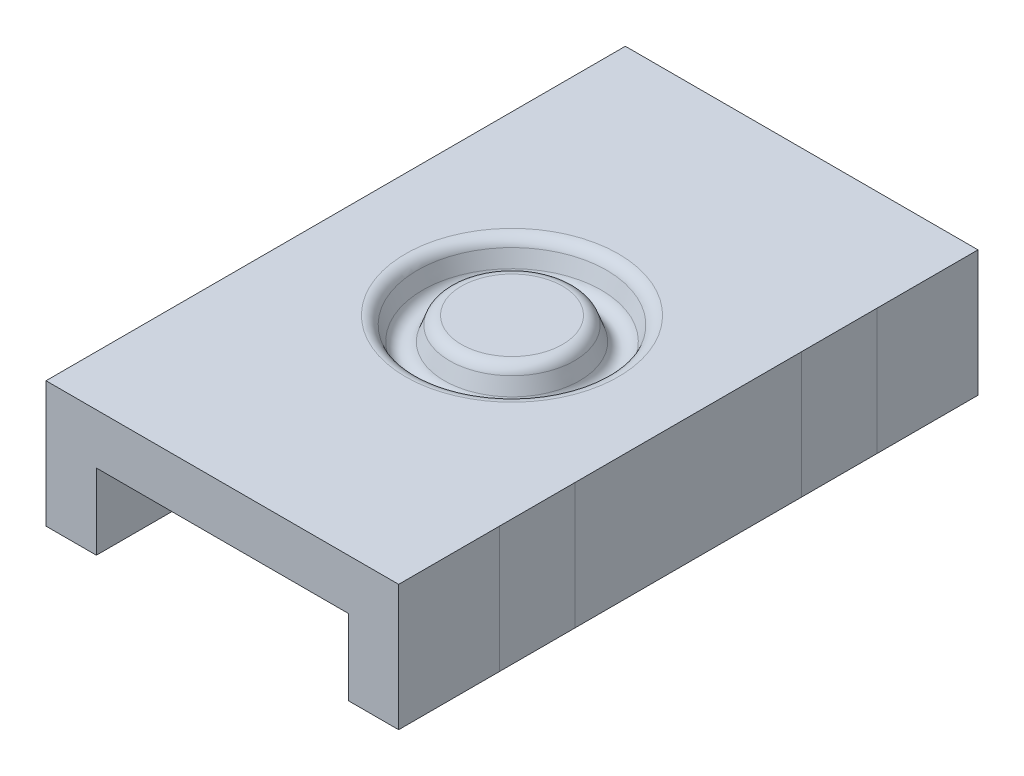
ISO-10303-21;
HEADER;
FILE_DESCRIPTION(('STEP AP214'),'2;1');
FILE_NAME('part.step','',(''),(''),'','','');
FILE_SCHEMA(('AUTOMOTIVE_DESIGN { 1 0 10303 214 1 1 1 1 }'));
ENDSEC;
DATA;
#1=APPLICATION_CONTEXT('core data for automotive mechanical design processes');
#2=APPLICATION_PROTOCOL_DEFINITION('international standard','automotive_design',2000,#1);
#3=PRODUCT_CONTEXT('',#1,'mechanical');
#4=PRODUCT('Part','Part','',(#3));
#5=PRODUCT_RELATED_PRODUCT_CATEGORY('part','',(#4));
#6=PRODUCT_DEFINITION_FORMATION('','',#4);
#7=PRODUCT_DEFINITION_CONTEXT('part definition',#1,'design');
#8=PRODUCT_DEFINITION('design','',#6,#7);
#9=PRODUCT_DEFINITION_SHAPE('','',#8);
#10=(LENGTH_UNIT() NAMED_UNIT(*) SI_UNIT(.MILLI.,.METRE.));
#11=(NAMED_UNIT(*) PLANE_ANGLE_UNIT() SI_UNIT($,.RADIAN.));
#12=(NAMED_UNIT(*) SI_UNIT($,.STERADIAN.) SOLID_ANGLE_UNIT());
#13=UNCERTAINTY_MEASURE_WITH_UNIT(LENGTH_MEASURE(1.E-05),#10,'distance_accuracy_value','');
#14=(GEOMETRIC_REPRESENTATION_CONTEXT(3) GLOBAL_UNCERTAINTY_ASSIGNED_CONTEXT((#13)) GLOBAL_UNIT_ASSIGNED_CONTEXT((#10,
#11,#12)) REPRESENTATION_CONTEXT('',''));
#15=CARTESIAN_POINT('',(0.,0.,0.));
#16=DIRECTION('',(0.,0.,1.));
#17=DIRECTION('',(1.,0.,0.));
#18=AXIS2_PLACEMENT_3D('',#15,#16,#17);
#19=CARTESIAN_POINT('',(14.,10.,23.));
#20=DIRECTION('',(-1.,0.,0.));
#21=DIRECTION('',(0.,0.,1.));
#22=AXIS2_PLACEMENT_3D('',#19,#20,#21);
#23=PLANE('',#22);
#24=DIRECTION('',(0.,-1.,0.));
#25=VECTOR('',#24,1.);
#26=CARTESIAN_POINT('',(14.,10.,-9.));
#27=LINE('',#26,#25);
#28=CARTESIAN_POINT('',(14.,10.,-9.));
#29=VERTEX_POINT('',#28);
#30=CARTESIAN_POINT('',(14.,0.,-9.));
#31=VERTEX_POINT('',#30);
#32=EDGE_CURVE('E12',#29,#31,#27,.T.);
#33=ORIENTED_EDGE('',*,*,#32,.F.);
#34=DIRECTION('',(0.,0.,-1.));
#35=VECTOR('',#34,1.);
#36=CARTESIAN_POINT('',(14.,10.,23.));
#37=LINE('',#36,#35);
#38=CARTESIAN_POINT('',(14.,10.,9.));
#39=VERTEX_POINT('',#38);
#40=EDGE_CURVE('E250',#39,#29,#37,.T.);
#41=ORIENTED_EDGE('',*,*,#40,.F.);
#42=DIRECTION('',(0.,1.,0.));
#43=VECTOR('',#42,1.);
#44=CARTESIAN_POINT('',(14.,10.,9.));
#45=LINE('',#44,#43);
#46=CARTESIAN_POINT('',(14.,0.,9.));
#47=VERTEX_POINT('',#46);
#48=EDGE_CURVE('E206',#47,#39,#45,.T.);
#49=ORIENTED_EDGE('',*,*,#48,.F.);
#50=DIRECTION('',(0.,0.,-1.));
#51=VECTOR('',#50,1.);
#52=CARTESIAN_POINT('',(14.,0.,23.));
#53=LINE('',#52,#51);
#54=EDGE_CURVE('E296',#47,#31,#53,.T.);
#55=ORIENTED_EDGE('',*,*,#54,.T.);
#56=EDGE_LOOP('',(#33,#41,#49,#55));
#57=FACE_BOUND('',#56,.T.);
#58=ADVANCED_FACE('F53',(#57),#23,.F.);
#59=DIRECTION('',(0.,1.,0.));
#60=VECTOR('',#59,1.);
#61=CARTESIAN_POINT('',(14.,9.99999999999999,-15.));
#62=LINE('',#61,#60);
#63=CARTESIAN_POINT('',(14.,0.,-15.));
#64=VERTEX_POINT('',#63);
#65=CARTESIAN_POINT('',(14.,10.,-15.));
#66=VERTEX_POINT('',#65);
#67=EDGE_CURVE('E63',#64,#66,#62,.T.);
#68=ORIENTED_EDGE('',*,*,#67,.F.);
#69=CARTESIAN_POINT('',(14.,0.,-23.));
#70=VERTEX_POINT('',#69);
#71=EDGE_CURVE('E182',#64,#70,#53,.T.);
#72=ORIENTED_EDGE('',*,*,#71,.T.);
#73=DIRECTION('',(0.,-1.,0.));
#74=VECTOR('',#73,1.);
#75=CARTESIAN_POINT('',(14.,10.,-23.));
#76=LINE('',#75,#74);
#77=CARTESIAN_POINT('',(14.,10.,-23.));
#78=VERTEX_POINT('',#77);
#79=EDGE_CURVE('E188',#78,#70,#76,.T.);
#80=ORIENTED_EDGE('',*,*,#79,.F.);
#81=EDGE_CURVE('E247',#66,#78,#37,.T.);
#82=ORIENTED_EDGE('',*,*,#81,.F.);
#83=EDGE_LOOP('',(#68,#72,#80,#82));
#84=FACE_BOUND('',#83,.T.);
#85=ADVANCED_FACE('F306',(#84),#23,.F.);
#86=DIRECTION('',(0.,-1.,0.));
#87=VECTOR('',#86,1.);
#88=CARTESIAN_POINT('',(14.,10.,15.));
#89=LINE('',#88,#87);
#90=CARTESIAN_POINT('',(14.,10.,15.));
#91=VERTEX_POINT('',#90);
#92=CARTESIAN_POINT('',(14.,0.,15.));
#93=VERTEX_POINT('',#92);
#94=EDGE_CURVE('E210',#91,#93,#89,.T.);
#95=ORIENTED_EDGE('',*,*,#94,.F.);
#96=CARTESIAN_POINT('',(14.,10.,23.));
#97=VERTEX_POINT('',#96);
#98=EDGE_CURVE('E242',#97,#91,#37,.T.);
#99=ORIENTED_EDGE('',*,*,#98,.F.);
#100=DIRECTION('',(0.,-1.,0.));
#101=VECTOR('',#100,1.);
#102=CARTESIAN_POINT('',(14.,10.,23.));
#103=LINE('',#102,#101);
#104=CARTESIAN_POINT('',(14.,0.,23.));
#105=VERTEX_POINT('',#104);
#106=EDGE_CURVE('E193',#97,#105,#103,.T.);
#107=ORIENTED_EDGE('',*,*,#106,.T.);
#108=EDGE_CURVE('E173',#105,#93,#53,.T.);
#109=ORIENTED_EDGE('',*,*,#108,.T.);
#110=EDGE_LOOP('',(#95,#99,#107,#109));
#111=FACE_BOUND('',#110,.T.);
#112=ADVANCED_FACE('F290',(#111),#23,.F.);
#113=EDGE_CURVE('E253',#29,#66,#37,.T.);
#114=ORIENTED_EDGE('',*,*,#113,.F.);
#115=ORIENTED_EDGE('',*,*,#32,.T.);
#116=EDGE_CURVE('E277',#31,#64,#53,.T.);
#117=ORIENTED_EDGE('',*,*,#116,.T.);
#118=ORIENTED_EDGE('',*,*,#67,.T.);
#119=EDGE_LOOP('',(#114,#115,#117,#118));
#120=FACE_BOUND('',#119,.T.);
#121=ADVANCED_FACE('F301',(#120),#23,.F.);
#122=CARTESIAN_POINT('',(0.,10.,0.));
#123=DIRECTION('',(0.,-1.,0.));
#124=DIRECTION('',(0.,0.,-1.));
#125=AXIS2_PLACEMENT_3D('',#122,#123,#124);
#126=PLANE('',#125);
#127=CARTESIAN_POINT('',(0.,10.,0.));
#128=DIRECTION('',(0.,-1.,0.));
#129=DIRECTION('',(0.,0.,-1.));
#130=AXIS2_PLACEMENT_3D('',#127,#128,#129);
#131=CIRCLE('',#130,8.45488555142449);
#132=CARTESIAN_POINT('',(0.,10.,-8.45488555142449));
#133=VERTEX_POINT('',#132);
#134=EDGE_CURVE('E229',#133,#133,#131,.T.);
#135=ORIENTED_EDGE('',*,*,#134,.T.);
#136=EDGE_LOOP('',(#135));
#137=FACE_BOUND('',#136,.T.);
#138=DIRECTION('',(0.,0.,1.));
#139=VECTOR('',#138,1.);
#140=CARTESIAN_POINT('',(-14.,10.,23.));
#141=LINE('',#140,#139);
#142=CARTESIAN_POINT('',(-14.,10.,-23.));
#143=VERTEX_POINT('',#142);
#144=CARTESIAN_POINT('',(-14.,10.,23.));
#145=VERTEX_POINT('',#144);
#146=EDGE_CURVE('E178',#143,#145,#141,.T.);
#147=ORIENTED_EDGE('',*,*,#146,.T.);
#148=DIRECTION('',(1.,0.,0.));
#149=VECTOR('',#148,1.);
#150=CARTESIAN_POINT('',(-14.,10.,23.));
#151=LINE('',#150,#149);
#152=EDGE_CURVE('E257',#145,#97,#151,.T.);
#153=ORIENTED_EDGE('',*,*,#152,.T.);
#154=ORIENTED_EDGE('',*,*,#98,.T.);
#155=EDGE_CURVE('E246',#91,#39,#37,.T.);
#156=ORIENTED_EDGE('',*,*,#155,.T.);
#157=ORIENTED_EDGE('',*,*,#40,.T.);
#158=ORIENTED_EDGE('',*,*,#113,.T.);
#159=ORIENTED_EDGE('',*,*,#81,.T.);
#160=DIRECTION('',(-1.,0.,0.));
#161=VECTOR('',#160,1.);
#162=CARTESIAN_POINT('',(-14.,10.,-23.));
#163=LINE('',#162,#161);
#164=EDGE_CURVE('E189',#78,#143,#163,.T.);
#165=ORIENTED_EDGE('',*,*,#164,.T.);
#166=EDGE_LOOP('',(#147,#153,#154,#156,#157,#158,#159,#165));
#167=FACE_BOUND('',#166,.T.);
#168=ADVANCED_FACE('F308',(#137,#167),#126,.F.);
#169=CARTESIAN_POINT('',(0.,0.,0.));
#170=DIRECTION('',(0.,-1.,0.));
#171=DIRECTION('',(0.,0.,-1.));
#172=AXIS2_PLACEMENT_3D('',#169,#170,#171);
#173=PLANE('',#172);
#174=DIRECTION('',(0.,0.,1.));
#175=VECTOR('',#174,1.);
#176=CARTESIAN_POINT('',(-10.,0.,-23.));
#177=LINE('',#176,#175);
#178=CARTESIAN_POINT('',(-10.,0.,-23.));
#179=VERTEX_POINT('',#178);
#180=CARTESIAN_POINT('',(-10.,0.,23.));
#181=VERTEX_POINT('',#180);
#182=EDGE_CURVE('E142',#179,#181,#177,.T.);
#183=ORIENTED_EDGE('',*,*,#182,.T.);
#184=DIRECTION('',(1.,0.,0.));
#185=VECTOR('',#184,1.);
#186=CARTESIAN_POINT('',(-14.,0.,23.));
#187=LINE('',#186,#185);
#188=CARTESIAN_POINT('',(-14.,0.,23.));
#189=VERTEX_POINT('',#188);
#190=EDGE_CURVE('E272',#189,#181,#187,.T.);
#191=ORIENTED_EDGE('',*,*,#190,.F.);
#192=DIRECTION('',(0.,0.,1.));
#193=VECTOR('',#192,1.);
#194=CARTESIAN_POINT('',(-14.,0.,23.));
#195=LINE('',#194,#193);
#196=CARTESIAN_POINT('',(-14.,0.,-23.));
#197=VERTEX_POINT('',#196);
#198=EDGE_CURVE('E170',#197,#189,#195,.T.);
#199=ORIENTED_EDGE('',*,*,#198,.F.);
#200=DIRECTION('',(-1.,0.,0.));
#201=VECTOR('',#200,1.);
#202=CARTESIAN_POINT('',(-14.,0.,-23.));
#203=LINE('',#202,#201);
#204=EDGE_CURVE('E159',#179,#197,#203,.T.);
#205=ORIENTED_EDGE('',*,*,#204,.F.);
#206=EDGE_LOOP('',(#183,#191,#199,#205));
#207=FACE_BOUND('',#206,.T.);
#208=ADVANCED_FACE('F168',(#207),#173,.T.);
#209=CARTESIAN_POINT('',(-14.,10.,23.));
#210=DIRECTION('',(1.,0.,0.));
#211=DIRECTION('',(0.,0.,-1.));
#212=AXIS2_PLACEMENT_3D('',#209,#210,#211);
#213=PLANE('',#212);
#214=ORIENTED_EDGE('',*,*,#198,.T.);
#215=DIRECTION('',(0.,-1.,0.));
#216=VECTOR('',#215,1.);
#217=CARTESIAN_POINT('',(-14.,10.,23.));
#218=LINE('',#217,#216);
#219=EDGE_CURVE('E198',#145,#189,#218,.T.);
#220=ORIENTED_EDGE('',*,*,#219,.F.);
#221=ORIENTED_EDGE('',*,*,#146,.F.);
#222=DIRECTION('',(0.,-1.,0.));
#223=VECTOR('',#222,1.);
#224=CARTESIAN_POINT('',(-14.,10.,-23.));
#225=LINE('',#224,#223);
#226=EDGE_CURVE('E185',#143,#197,#225,.T.);
#227=ORIENTED_EDGE('',*,*,#226,.T.);
#228=EDGE_LOOP('',(#214,#220,#221,#227));
#229=FACE_BOUND('',#228,.T.);
#230=ADVANCED_FACE('F312',(#229),#213,.F.);
#231=CARTESIAN_POINT('',(-14.,10.,23.));
#232=DIRECTION('',(0.,0.,-1.));
#233=DIRECTION('',(-1.,0.,0.));
#234=AXIS2_PLACEMENT_3D('',#231,#232,#233);
#235=PLANE('',#234);
#236=ORIENTED_EDGE('',*,*,#190,.T.);
#237=DIRECTION('',(0.,-1.,0.));
#238=VECTOR('',#237,1.);
#239=CARTESIAN_POINT('',(-10.,0.,23.));
#240=LINE('',#239,#238);
#241=CARTESIAN_POINT('',(-10.,6.,23.));
#242=VERTEX_POINT('',#241);
#243=EDGE_CURVE('E148',#242,#181,#240,.T.);
#244=ORIENTED_EDGE('',*,*,#243,.F.);
#245=DIRECTION('',(-1.,0.,0.));
#246=VECTOR('',#245,1.);
#247=CARTESIAN_POINT('',(-10.,6.,23.));
#248=LINE('',#247,#246);
#249=CARTESIAN_POINT('',(10.,6.,23.));
#250=VERTEX_POINT('',#249);
#251=EDGE_CURVE('E165',#250,#242,#248,.T.);
#252=ORIENTED_EDGE('',*,*,#251,.F.);
#253=DIRECTION('',(0.,1.,0.));
#254=VECTOR('',#253,1.);
#255=CARTESIAN_POINT('',(10.,0.,23.));
#256=LINE('',#255,#254);
#257=CARTESIAN_POINT('',(10.,0.,23.));
#258=VERTEX_POINT('',#257);
#259=EDGE_CURVE('E285',#258,#250,#256,.T.);
#260=ORIENTED_EDGE('',*,*,#259,.F.);
#261=EDGE_CURVE('E270',#258,#105,#187,.T.);
#262=ORIENTED_EDGE('',*,*,#261,.T.);
#263=ORIENTED_EDGE('',*,*,#106,.F.);
#264=ORIENTED_EDGE('',*,*,#152,.F.);
#265=ORIENTED_EDGE('',*,*,#219,.T.);
#266=EDGE_LOOP('',(#236,#244,#252,#260,#262,#263,#264,#265));
#267=FACE_BOUND('',#266,.T.);
#268=ADVANCED_FACE('F281',(#267),#235,.F.);
#269=ORIENTED_EDGE('',*,*,#155,.F.);
#270=ORIENTED_EDGE('',*,*,#94,.T.);
#271=EDGE_CURVE('E180',#93,#47,#53,.T.);
#272=ORIENTED_EDGE('',*,*,#271,.T.);
#273=ORIENTED_EDGE('',*,*,#48,.T.);
#274=EDGE_LOOP('',(#269,#270,#272,#273));
#275=FACE_BOUND('',#274,.T.);
#276=ADVANCED_FACE('F310',(#275),#23,.F.);
#277=CARTESIAN_POINT('',(-14.,10.,-23.));
#278=DIRECTION('',(0.,0.,1.));
#279=DIRECTION('',(1.,0.,0.));
#280=AXIS2_PLACEMENT_3D('',#277,#278,#279);
#281=PLANE('',#280);
#282=DIRECTION('',(-1.,0.,0.));
#283=VECTOR('',#282,1.);
#284=CARTESIAN_POINT('',(-10.,6.,-23.));
#285=LINE('',#284,#283);
#286=CARTESIAN_POINT('',(10.,6.,-23.));
#287=VERTEX_POINT('',#286);
#288=CARTESIAN_POINT('',(-10.,6.,-23.));
#289=VERTEX_POINT('',#288);
#290=EDGE_CURVE('E154',#287,#289,#285,.T.);
#291=ORIENTED_EDGE('',*,*,#290,.T.);
#292=DIRECTION('',(0.,-1.,0.));
#293=VECTOR('',#292,1.);
#294=CARTESIAN_POINT('',(-10.,0.,-23.));
#295=LINE('',#294,#293);
#296=EDGE_CURVE('E145',#289,#179,#295,.T.);
#297=ORIENTED_EDGE('',*,*,#296,.T.);
#298=ORIENTED_EDGE('',*,*,#204,.T.);
#299=ORIENTED_EDGE('',*,*,#226,.F.);
#300=ORIENTED_EDGE('',*,*,#164,.F.);
#301=ORIENTED_EDGE('',*,*,#79,.T.);
#302=CARTESIAN_POINT('',(10.,0.,-23.));
#303=VERTEX_POINT('',#302);
#304=EDGE_CURVE('E172',#70,#303,#203,.T.);
#305=ORIENTED_EDGE('',*,*,#304,.T.);
#306=DIRECTION('',(0.,1.,0.));
#307=VECTOR('',#306,1.);
#308=CARTESIAN_POINT('',(10.,0.,-23.));
#309=LINE('',#308,#307);
#310=EDGE_CURVE('E164',#303,#287,#309,.T.);
#311=ORIENTED_EDGE('',*,*,#310,.T.);
#312=EDGE_LOOP('',(#291,#297,#298,#299,#300,#301,#305,#311));
#313=FACE_BOUND('',#312,.T.);
#314=ADVANCED_FACE('F157',(#313),#281,.F.);
#315=DIRECTION('',(0.,0.,1.));
#316=VECTOR('',#315,1.);
#317=CARTESIAN_POINT('',(10.,0.,-23.));
#318=LINE('',#317,#316);
#319=EDGE_CURVE('E153',#303,#258,#318,.T.);
#320=ORIENTED_EDGE('',*,*,#319,.F.);
#321=ORIENTED_EDGE('',*,*,#304,.F.);
#322=ORIENTED_EDGE('',*,*,#71,.F.);
#323=ORIENTED_EDGE('',*,*,#116,.F.);
#324=ORIENTED_EDGE('',*,*,#54,.F.);
#325=ORIENTED_EDGE('',*,*,#271,.F.);
#326=ORIENTED_EDGE('',*,*,#108,.F.);
#327=ORIENTED_EDGE('',*,*,#261,.F.);
#328=EDGE_LOOP('',(#320,#321,#322,#323,#324,#325,#326,#327));
#329=FACE_BOUND('',#328,.T.);
#330=ADVANCED_FACE('F292',(#329),#173,.T.);
#331=CARTESIAN_POINT('',(-10.,0.,-23.));
#332=DIRECTION('',(-1.,0.,0.));
#333=DIRECTION('',(0.,0.,1.));
#334=AXIS2_PLACEMENT_3D('',#331,#332,#333);
#335=PLANE('',#334);
#336=ORIENTED_EDGE('',*,*,#243,.T.);
#337=ORIENTED_EDGE('',*,*,#182,.F.);
#338=ORIENTED_EDGE('',*,*,#296,.F.);
#339=DIRECTION('',(0.,0.,1.));
#340=VECTOR('',#339,1.);
#341=CARTESIAN_POINT('',(-10.,6.,-23.));
#342=LINE('',#341,#340);
#343=EDGE_CURVE('E271',#289,#242,#342,.T.);
#344=ORIENTED_EDGE('',*,*,#343,.T.);
#345=EDGE_LOOP('',(#336,#337,#338,#344));
#346=FACE_BOUND('',#345,.T.);
#347=ADVANCED_FACE('F144',(#346),#335,.F.);
#348=CARTESIAN_POINT('',(-10.,6.,-23.));
#349=DIRECTION('',(0.,1.,0.));
#350=DIRECTION('',(-1.,0.,0.));
#351=AXIS2_PLACEMENT_3D('',#348,#349,#350);
#352=PLANE('',#351);
#353=ORIENTED_EDGE('',*,*,#251,.T.);
#354=ORIENTED_EDGE('',*,*,#343,.F.);
#355=ORIENTED_EDGE('',*,*,#290,.F.);
#356=DIRECTION('',(0.,0.,1.));
#357=VECTOR('',#356,1.);
#358=CARTESIAN_POINT('',(10.,6.,-23.));
#359=LINE('',#358,#357);
#360=EDGE_CURVE('E508',#287,#250,#359,.T.);
#361=ORIENTED_EDGE('',*,*,#360,.T.);
#362=EDGE_LOOP('',(#353,#354,#355,#361));
#363=FACE_BOUND('',#362,.T.);
#364=ADVANCED_FACE('F379',(#363),#352,.F.);
#365=CARTESIAN_POINT('',(10.,0.,-23.));
#366=DIRECTION('',(1.,0.,0.));
#367=DIRECTION('',(0.,1.,0.));
#368=AXIS2_PLACEMENT_3D('',#365,#366,#367);
#369=PLANE('',#368);
#370=ORIENTED_EDGE('',*,*,#259,.T.);
#371=ORIENTED_EDGE('',*,*,#360,.F.);
#372=ORIENTED_EDGE('',*,*,#310,.F.);
#373=ORIENTED_EDGE('',*,*,#319,.T.);
#374=EDGE_LOOP('',(#370,#371,#372,#373));
#375=FACE_BOUND('',#374,.T.);
#376=ADVANCED_FACE('F386',(#375),#369,.F.);
#377=CARTESIAN_POINT('',(0.,8.5,0.));
#378=DIRECTION('',(0.,-1.,0.));
#379=DIRECTION('',(0.,0.,-1.));
#380=AXIS2_PLACEMENT_3D('',#377,#378,#379);
#381=TOROIDAL_SURFACE('',#380,6.235,0.914999999999999);
#382=CARTESIAN_POINT('',(0.,8.18705156885691,0.));
#383=DIRECTION('',(0.,-1.,0.));
#384=DIRECTION('',(0.,0.,-1.));
#385=AXIS2_PLACEMENT_3D('',#382,#383,#384);
#386=CIRCLE('',#385,7.09481874801911);
#387=CARTESIAN_POINT('',(0.,8.18705156885691,-7.09481874801911));
#388=VERTEX_POINT('',#387);
#389=EDGE_CURVE('E487',#388,#388,#386,.T.);
#390=ORIENTED_EDGE('',*,*,#389,.F.);
#391=EDGE_LOOP('',(#390));
#392=FACE_BOUND('',#391,.T.);
#393=CARTESIAN_POINT('',(0.,8.18705156885691,0.));
#394=DIRECTION('',(0.,-1.,0.));
#395=DIRECTION('',(0.,0.,-1.));
#396=AXIS2_PLACEMENT_3D('',#393,#394,#395);
#397=CIRCLE('',#396,5.3751812519809);
#398=CARTESIAN_POINT('',(0.,8.18705156885691,-5.3751812519809));
#399=VERTEX_POINT('',#398);
#400=EDGE_CURVE('E489',#399,#399,#397,.T.);
#401=ORIENTED_EDGE('',*,*,#400,.T.);
#402=EDGE_LOOP('',(#401));
#403=FACE_BOUND('',#402,.T.);
#404=ADVANCED_FACE('F394',(#392,#403),#381,.F.);
#405=CARTESIAN_POINT('',(0.,8.18705156885691,0.));
#406=DIRECTION('',(0.,1.,0.));
#407=DIRECTION('',(0.,0.,1.));
#408=AXIS2_PLACEMENT_3D('',#405,#406,#407);
#409=CONICAL_SURFACE('',#408,7.09481874801911,0.349065850398847);
#410=CARTESIAN_POINT('',(0.,9.34202014332565,0.));
#411=DIRECTION('',(0.,-1.,0.));
#412=DIRECTION('',(0.,0.,-1.));
#413=AXIS2_PLACEMENT_3D('',#410,#411,#412);
#414=CIRCLE('',#413,7.51519293063857);
#415=CARTESIAN_POINT('',(0.,9.34202014332565,-7.51519293063857));
#416=VERTEX_POINT('',#415);
#417=EDGE_CURVE('E211',#416,#416,#414,.F.);
#418=ORIENTED_EDGE('',*,*,#417,.T.);
#419=EDGE_LOOP('',(#418));
#420=FACE_BOUND('',#419,.T.);
#421=ORIENTED_EDGE('',*,*,#389,.T.);
#422=EDGE_LOOP('',(#421));
#423=FACE_BOUND('',#422,.T.);
#424=ADVANCED_FACE('F416',(#420,#423),#409,.F.);
#425=CARTESIAN_POINT('',(0.,10.,0.));
#426=DIRECTION('',(0.,-1.,0.));
#427=DIRECTION('',(0.,0.,-1.));
#428=AXIS2_PLACEMENT_3D('',#425,#426,#427);
#429=CONICAL_SURFACE('',#428,4.71532198678524,0.349065850398847);
#430=CARTESIAN_POINT('',(0.,9.34202014332565,0.));
#431=DIRECTION('',(0.,1.,0.));
#432=DIRECTION('',(0.,0.,1.));
#433=AXIS2_PLACEMENT_3D('',#430,#431,#432);
#434=CIRCLE('',#433,4.95480706936143);
#435=CARTESIAN_POINT('',(0.,9.34202014332565,4.95480706936143));
#436=VERTEX_POINT('',#435);
#437=EDGE_CURVE('E235',#436,#436,#434,.F.);
#438=ORIENTED_EDGE('',*,*,#437,.T.);
#439=EDGE_LOOP('',(#438));
#440=FACE_BOUND('',#439,.T.);
#441=ORIENTED_EDGE('',*,*,#400,.F.);
#442=EDGE_LOOP('',(#441));
#443=FACE_BOUND('',#442,.T.);
#444=ADVANCED_FACE('F405',(#440,#443),#429,.T.);
#445=CARTESIAN_POINT('',(0.,10.,0.));
#446=DIRECTION('',(0.,-1.,0.));
#447=DIRECTION('',(0.,0.,-1.));
#448=AXIS2_PLACEMENT_3D('',#445,#446,#447);
#449=CIRCLE('',#448,4.01511444857552);
#450=CARTESIAN_POINT('',(0.,10.,-4.01511444857552));
#451=VERTEX_POINT('',#450);
#452=EDGE_CURVE('E232',#451,#451,#449,.F.);
#453=ORIENTED_EDGE('',*,*,#452,.T.);
#454=EDGE_LOOP('',(#453));
#455=FACE_BOUND('',#454,.T.);
#456=ADVANCED_FACE('F337',(#455),#126,.F.);
#457=CARTESIAN_POINT('',(0.,9.,0.));
#458=DIRECTION('',(0.,-1.,0.));
#459=DIRECTION('',(0.,0.,-1.));
#460=AXIS2_PLACEMENT_3D('',#457,#458,#459);
#461=TOROIDAL_SURFACE('',#460,4.01511444857552,1.);
#462=ORIENTED_EDGE('',*,*,#452,.F.);
#463=EDGE_LOOP('',(#462));
#464=FACE_BOUND('',#463,.T.);
#465=ORIENTED_EDGE('',*,*,#437,.F.);
#466=EDGE_LOOP('',(#465));
#467=FACE_BOUND('',#466,.T.);
#468=ADVANCED_FACE('F404',(#464,#467),#461,.T.);
#469=CARTESIAN_POINT('',(0.,9.,0.));
#470=DIRECTION('',(0.,-1.,0.));
#471=DIRECTION('',(0.,0.,-1.));
#472=AXIS2_PLACEMENT_3D('',#469,#470,#471);
#473=TOROIDAL_SURFACE('',#472,8.45488555142449,1.);
#474=ORIENTED_EDGE('',*,*,#417,.F.);
#475=EDGE_LOOP('',(#474));
#476=FACE_BOUND('',#475,.T.);
#477=ORIENTED_EDGE('',*,*,#134,.F.);
#478=EDGE_LOOP('',(#477));
#479=FACE_BOUND('',#478,.T.);
#480=ADVANCED_FACE('F55',(#476,#479),#473,.T.);
#481=CLOSED_SHELL('',(#58,#85,#112,#121,#168,#208,#230,#268,#276,#314,#330,#347,#364,#376,#404,
#424,#444,#456,#468,#480));
#482=MANIFOLD_SOLID_BREP('B2',#481);
#483=ADVANCED_BREP_SHAPE_REPRESENTATION('',(#18,#482),#14);
#484=SHAPE_DEFINITION_REPRESENTATION(#9,#483);
ENDSEC;
END-ISO-10303-21;
